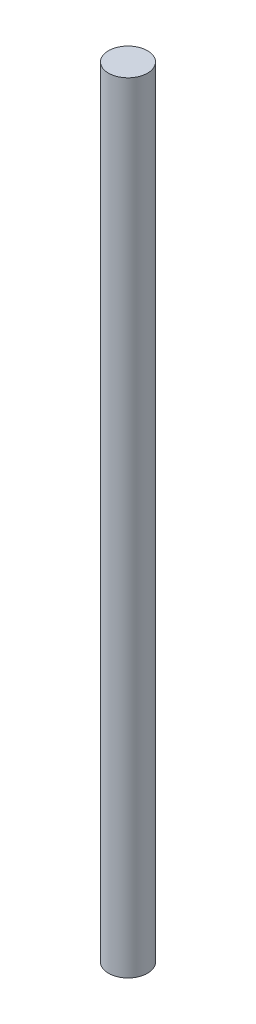
ISO-10303-21;
HEADER;
FILE_DESCRIPTION(('STEP AP214'),'2;1');
FILE_NAME('part.step','',(''),(''),'','','');
FILE_SCHEMA(('AUTOMOTIVE_DESIGN { 1 0 10303 214 1 1 1 1 }'));
ENDSEC;
DATA;
#1=APPLICATION_CONTEXT('core data for automotive mechanical design processes');
#2=APPLICATION_PROTOCOL_DEFINITION('international standard','automotive_design',2000,#1);
#3=PRODUCT_CONTEXT('',#1,'mechanical');
#4=PRODUCT('Part','Part','',(#3));
#5=PRODUCT_RELATED_PRODUCT_CATEGORY('part','',(#4));
#6=PRODUCT_DEFINITION_FORMATION('','',#4);
#7=PRODUCT_DEFINITION_CONTEXT('part definition',#1,'design');
#8=PRODUCT_DEFINITION('design','',#6,#7);
#9=PRODUCT_DEFINITION_SHAPE('','',#8);
#10=(LENGTH_UNIT() NAMED_UNIT(*) SI_UNIT(.MILLI.,.METRE.));
#11=(NAMED_UNIT(*) PLANE_ANGLE_UNIT() SI_UNIT($,.RADIAN.));
#12=(NAMED_UNIT(*) SI_UNIT($,.STERADIAN.) SOLID_ANGLE_UNIT());
#13=UNCERTAINTY_MEASURE_WITH_UNIT(LENGTH_MEASURE(1.E-05),#10,'distance_accuracy_value','');
#14=(GEOMETRIC_REPRESENTATION_CONTEXT(3) GLOBAL_UNCERTAINTY_ASSIGNED_CONTEXT((#13)) GLOBAL_UNIT_ASSIGNED_CONTEXT((#10,
#11,#12)) REPRESENTATION_CONTEXT('',''));
#15=CARTESIAN_POINT('',(0.,0.,0.));
#16=DIRECTION('',(0.,0.,1.));
#17=DIRECTION('',(1.,0.,0.));
#18=AXIS2_PLACEMENT_3D('',#15,#16,#17);
#19=CARTESIAN_POINT('',(0.,25.,0.));
#20=DIRECTION('',(0.,-1.,0.));
#21=DIRECTION('',(0.,0.,-1.));
#22=AXIS2_PLACEMENT_3D('',#19,#20,#21);
#23=CYLINDRICAL_SURFACE('',#22,0.625);
#24=CARTESIAN_POINT('',(0.,25.,0.));
#25=DIRECTION('',(0.,1.,0.));
#26=DIRECTION('',(0.,0.,1.));
#27=AXIS2_PLACEMENT_3D('',#24,#25,#26);
#28=CIRCLE('',#27,0.625);
#29=CARTESIAN_POINT('',(0.,25.,0.625));
#30=VERTEX_POINT('',#29);
#31=EDGE_CURVE('E10',#30,#30,#28,.T.);
#32=ORIENTED_EDGE('',*,*,#31,.F.);
#33=EDGE_LOOP('',(#32));
#34=FACE_BOUND('',#33,.T.);
#35=CARTESIAN_POINT('',(0.,0.,0.));
#36=DIRECTION('',(0.,1.,0.));
#37=DIRECTION('',(0.,0.,1.));
#38=AXIS2_PLACEMENT_3D('',#35,#36,#37);
#39=CIRCLE('',#38,0.625);
#40=CARTESIAN_POINT('',(0.,0.,0.625));
#41=VERTEX_POINT('',#40);
#42=EDGE_CURVE('E38',#41,#41,#39,.T.);
#43=ORIENTED_EDGE('',*,*,#42,.T.);
#44=EDGE_LOOP('',(#43));
#45=FACE_BOUND('',#44,.T.);
#46=ADVANCED_FACE('F35',(#34,#45),#23,.T.);
#47=CARTESIAN_POINT('',(0.,25.,0.));
#48=DIRECTION('',(0.,1.,0.));
#49=DIRECTION('',(0.,0.,1.));
#50=AXIS2_PLACEMENT_3D('',#47,#48,#49);
#51=PLANE('',#50);
#52=ORIENTED_EDGE('',*,*,#31,.T.);
#53=EDGE_LOOP('',(#52));
#54=FACE_BOUND('',#53,.T.);
#55=ADVANCED_FACE('F50',(#54),#51,.T.);
#56=CARTESIAN_POINT('',(0.,0.,0.));
#57=DIRECTION('',(0.,1.,0.));
#58=DIRECTION('',(0.,0.,1.));
#59=AXIS2_PLACEMENT_3D('',#56,#57,#58);
#60=PLANE('',#59);
#61=ORIENTED_EDGE('',*,*,#42,.F.);
#62=EDGE_LOOP('',(#61));
#63=FACE_BOUND('',#62,.T.);
#64=ADVANCED_FACE('F48',(#63),#60,.F.);
#65=CLOSED_SHELL('',(#46,#55,#64));
#66=MANIFOLD_SOLID_BREP('B2',#65);
#67=ADVANCED_BREP_SHAPE_REPRESENTATION('',(#18,#66),#14);
#68=SHAPE_DEFINITION_REPRESENTATION(#9,#67);
ENDSEC;
END-ISO-10303-21;
